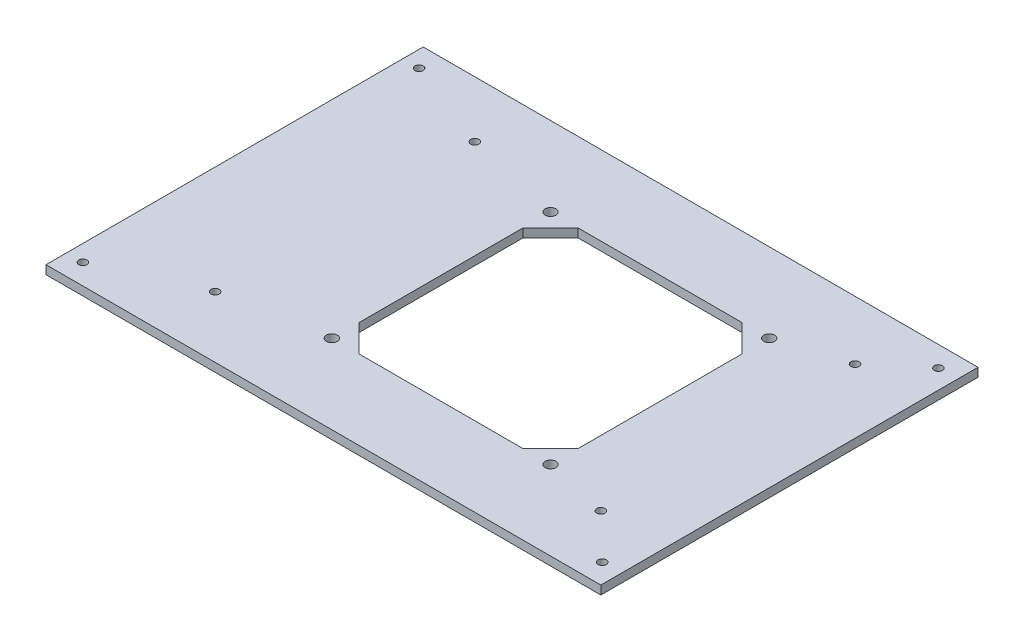
ISO-10303-21;
HEADER;
FILE_DESCRIPTION(('STEP AP214'),'2;1');
FILE_NAME('part.step','',(''),(''),'','','');
FILE_SCHEMA(('AUTOMOTIVE_DESIGN { 1 0 10303 214 1 1 1 1 }'));
ENDSEC;
DATA;
#1=APPLICATION_CONTEXT('core data for automotive mechanical design processes');
#2=APPLICATION_PROTOCOL_DEFINITION('international standard','automotive_design',2000,#1);
#3=PRODUCT_CONTEXT('',#1,'mechanical');
#4=PRODUCT('Part','Part','',(#3));
#5=PRODUCT_RELATED_PRODUCT_CATEGORY('part','',(#4));
#6=PRODUCT_DEFINITION_FORMATION('','',#4);
#7=PRODUCT_DEFINITION_CONTEXT('part definition',#1,'design');
#8=PRODUCT_DEFINITION('design','',#6,#7);
#9=PRODUCT_DEFINITION_SHAPE('','',#8);
#10=(LENGTH_UNIT() NAMED_UNIT(*) SI_UNIT(.MILLI.,.METRE.));
#11=(NAMED_UNIT(*) PLANE_ANGLE_UNIT() SI_UNIT($,.RADIAN.));
#12=(NAMED_UNIT(*) SI_UNIT($,.STERADIAN.) SOLID_ANGLE_UNIT());
#13=UNCERTAINTY_MEASURE_WITH_UNIT(LENGTH_MEASURE(1.E-05),#10,'distance_accuracy_value','');
#14=(GEOMETRIC_REPRESENTATION_CONTEXT(3) GLOBAL_UNCERTAINTY_ASSIGNED_CONTEXT((#13)) GLOBAL_UNIT_ASSIGNED_CONTEXT((#10,
#11,#12)) REPRESENTATION_CONTEXT('',''));
#15=CARTESIAN_POINT('',(0.,0.,0.));
#16=DIRECTION('',(0.,0.,1.));
#17=DIRECTION('',(1.,0.,0.));
#18=AXIS2_PLACEMENT_3D('',#15,#16,#17);
#19=CARTESIAN_POINT('',(-101.5,3.175,69.));
#20=DIRECTION('',(1.,0.,0.));
#21=DIRECTION('',(0.,0.,-1.));
#22=AXIS2_PLACEMENT_3D('',#19,#20,#21);
#23=PLANE('',#22);
#24=DIRECTION('',(0.,0.,1.));
#25=VECTOR('',#24,1.);
#26=CARTESIAN_POINT('',(-101.5,0.,69.));
#27=LINE('',#26,#25);
#28=CARTESIAN_POINT('',(-101.5,0.,-69.));
#29=VERTEX_POINT('',#28);
#30=CARTESIAN_POINT('',(-101.5,0.,69.));
#31=VERTEX_POINT('',#30);
#32=EDGE_CURVE('E313',#29,#31,#27,.T.);
#33=ORIENTED_EDGE('',*,*,#32,.T.);
#34=DIRECTION('',(0.,-1.,0.));
#35=VECTOR('',#34,1.);
#36=CARTESIAN_POINT('',(-101.5,3.175,69.));
#37=LINE('',#36,#35);
#38=CARTESIAN_POINT('',(-101.5,3.175,69.));
#39=VERTEX_POINT('',#38);
#40=EDGE_CURVE('E11',#39,#31,#37,.T.);
#41=ORIENTED_EDGE('',*,*,#40,.F.);
#42=DIRECTION('',(0.,0.,1.));
#43=VECTOR('',#42,1.);
#44=CARTESIAN_POINT('',(-101.5,3.175,69.));
#45=LINE('',#44,#43);
#46=CARTESIAN_POINT('',(-101.5,3.175,-69.));
#47=VERTEX_POINT('',#46);
#48=EDGE_CURVE('E314',#47,#39,#45,.T.);
#49=ORIENTED_EDGE('',*,*,#48,.F.);
#50=DIRECTION('',(0.,-1.,0.));
#51=VECTOR('',#50,1.);
#52=CARTESIAN_POINT('',(-101.5,3.175,-69.));
#53=LINE('',#52,#51);
#54=EDGE_CURVE('E328',#47,#29,#53,.T.);
#55=ORIENTED_EDGE('',*,*,#54,.T.);
#56=EDGE_LOOP('',(#33,#41,#49,#55));
#57=FACE_BOUND('',#56,.T.);
#58=ADVANCED_FACE('F39',(#57),#23,.F.);
#59=CARTESIAN_POINT('',(101.5,3.175,69.));
#60=DIRECTION('',(0.,0.,-1.));
#61=DIRECTION('',(-1.,0.,0.));
#62=AXIS2_PLACEMENT_3D('',#59,#60,#61);
#63=PLANE('',#62);
#64=DIRECTION('',(1.,0.,0.));
#65=VECTOR('',#64,1.);
#66=CARTESIAN_POINT('',(101.5,0.,69.));
#67=LINE('',#66,#65);
#68=CARTESIAN_POINT('',(101.5,0.,69.));
#69=VERTEX_POINT('',#68);
#70=EDGE_CURVE('E332',#31,#69,#67,.T.);
#71=ORIENTED_EDGE('',*,*,#70,.T.);
#72=DIRECTION('',(0.,-1.,0.));
#73=VECTOR('',#72,1.);
#74=CARTESIAN_POINT('',(101.5,3.175,69.));
#75=LINE('',#74,#73);
#76=CARTESIAN_POINT('',(101.5,3.175,69.));
#77=VERTEX_POINT('',#76);
#78=EDGE_CURVE('E47',#77,#69,#75,.T.);
#79=ORIENTED_EDGE('',*,*,#78,.F.);
#80=DIRECTION('',(1.,0.,0.));
#81=VECTOR('',#80,1.);
#82=CARTESIAN_POINT('',(101.5,3.175,69.));
#83=LINE('',#82,#81);
#84=EDGE_CURVE('E318',#39,#77,#83,.T.);
#85=ORIENTED_EDGE('',*,*,#84,.F.);
#86=ORIENTED_EDGE('',*,*,#40,.T.);
#87=EDGE_LOOP('',(#71,#79,#85,#86));
#88=FACE_BOUND('',#87,.T.);
#89=ADVANCED_FACE('F367',(#88),#63,.F.);
#90=CARTESIAN_POINT('',(101.5,3.175,69.));
#91=DIRECTION('',(-1.,0.,0.));
#92=DIRECTION('',(0.,0.,1.));
#93=AXIS2_PLACEMENT_3D('',#90,#91,#92);
#94=PLANE('',#93);
#95=DIRECTION('',(0.,0.,-1.));
#96=VECTOR('',#95,1.);
#97=CARTESIAN_POINT('',(101.5,0.,69.));
#98=LINE('',#97,#96);
#99=CARTESIAN_POINT('',(101.5,0.,-69.));
#100=VERTEX_POINT('',#99);
#101=EDGE_CURVE('E335',#69,#100,#98,.T.);
#102=ORIENTED_EDGE('',*,*,#101,.T.);
#103=DIRECTION('',(0.,-1.,0.));
#104=VECTOR('',#103,1.);
#105=CARTESIAN_POINT('',(101.5,3.175,-69.));
#106=LINE('',#105,#104);
#107=CARTESIAN_POINT('',(101.5,3.175,-69.));
#108=VERTEX_POINT('',#107);
#109=EDGE_CURVE('E343',#108,#100,#106,.T.);
#110=ORIENTED_EDGE('',*,*,#109,.F.);
#111=DIRECTION('',(0.,0.,-1.));
#112=VECTOR('',#111,1.);
#113=CARTESIAN_POINT('',(101.5,3.175,69.));
#114=LINE('',#113,#112);
#115=EDGE_CURVE('E322',#77,#108,#114,.T.);
#116=ORIENTED_EDGE('',*,*,#115,.F.);
#117=ORIENTED_EDGE('',*,*,#78,.T.);
#118=EDGE_LOOP('',(#102,#110,#116,#117));
#119=FACE_BOUND('',#118,.T.);
#120=ADVANCED_FACE('F352',(#119),#94,.F.);
#121=CARTESIAN_POINT('',(101.5,3.175,-69.));
#122=DIRECTION('',(0.,0.,1.));
#123=DIRECTION('',(1.,0.,0.));
#124=AXIS2_PLACEMENT_3D('',#121,#122,#123);
#125=PLANE('',#124);
#126=DIRECTION('',(-1.,0.,0.));
#127=VECTOR('',#126,1.);
#128=CARTESIAN_POINT('',(101.5,0.,-69.));
#129=LINE('',#128,#127);
#130=EDGE_CURVE('E319',#100,#29,#129,.T.);
#131=ORIENTED_EDGE('',*,*,#130,.T.);
#132=ORIENTED_EDGE('',*,*,#54,.F.);
#133=DIRECTION('',(-1.,0.,0.));
#134=VECTOR('',#133,1.);
#135=CARTESIAN_POINT('',(101.5,3.175,-69.));
#136=LINE('',#135,#134);
#137=EDGE_CURVE('E325',#108,#47,#136,.T.);
#138=ORIENTED_EDGE('',*,*,#137,.F.);
#139=ORIENTED_EDGE('',*,*,#109,.T.);
#140=EDGE_LOOP('',(#131,#132,#138,#139));
#141=FACE_BOUND('',#140,.T.);
#142=ADVANCED_FACE('F360',(#141),#125,.F.);
#143=CARTESIAN_POINT('',(0.,3.175,0.));
#144=DIRECTION('',(0.,1.,0.));
#145=DIRECTION('',(0.,0.,1.));
#146=AXIS2_PLACEMENT_3D('',#143,#144,#145);
#147=PLANE('',#146);
#148=DIRECTION('',(0.,0.,1.));
#149=VECTOR('',#148,1.);
#150=CARTESIAN_POINT('',(-25.9,3.175,-30.));
#151=LINE('',#150,#149);
#152=CARTESIAN_POINT('',(-25.9,3.175,-30.));
#153=VERTEX_POINT('',#152);
#154=CARTESIAN_POINT('',(-25.9,3.175,30.));
#155=VERTEX_POINT('',#154);
#156=EDGE_CURVE('E54',#153,#155,#151,.T.);
#157=ORIENTED_EDGE('',*,*,#156,.F.);
#158=DIRECTION('',(0.707106781186548,0.,-0.707106781186547));
#159=VECTOR('',#158,1.);
#160=CARTESIAN_POINT('',(-25.9,3.175,-30.));
#161=LINE('',#160,#159);
#162=CARTESIAN_POINT('',(-15.9,3.175,-40.));
#163=VERTEX_POINT('',#162);
#164=EDGE_CURVE('E150',#153,#163,#161,.T.);
#165=ORIENTED_EDGE('',*,*,#164,.T.);
#166=DIRECTION('',(1.,0.,0.));
#167=VECTOR('',#166,1.);
#168=CARTESIAN_POINT('',(-15.9,3.175,-40.));
#169=LINE('',#168,#167);
#170=CARTESIAN_POINT('',(44.1,3.175,-40.));
#171=VERTEX_POINT('',#170);
#172=EDGE_CURVE('E154',#163,#171,#169,.T.);
#173=ORIENTED_EDGE('',*,*,#172,.T.);
#174=DIRECTION('',(0.707106781186548,0.,0.707106781186547));
#175=VECTOR('',#174,1.);
#176=CARTESIAN_POINT('',(44.1,3.175,-40.));
#177=LINE('',#176,#175);
#178=CARTESIAN_POINT('',(54.1,3.175,-30.));
#179=VERTEX_POINT('',#178);
#180=EDGE_CURVE('E190',#171,#179,#177,.T.);
#181=ORIENTED_EDGE('',*,*,#180,.T.);
#182=DIRECTION('',(0.,0.,1.));
#183=VECTOR('',#182,1.);
#184=CARTESIAN_POINT('',(54.1,3.175,-30.));
#185=LINE('',#184,#183);
#186=CARTESIAN_POINT('',(54.1,3.175,30.));
#187=VERTEX_POINT('',#186);
#188=EDGE_CURVE('E186',#179,#187,#185,.T.);
#189=ORIENTED_EDGE('',*,*,#188,.T.);
#190=DIRECTION('',(-0.707106781186547,0.,0.707106781186548));
#191=VECTOR('',#190,1.);
#192=CARTESIAN_POINT('',(54.1,3.175,30.));
#193=LINE('',#192,#191);
#194=CARTESIAN_POINT('',(44.1,3.175,40.));
#195=VERTEX_POINT('',#194);
#196=EDGE_CURVE('E182',#187,#195,#193,.T.);
#197=ORIENTED_EDGE('',*,*,#196,.T.);
#198=DIRECTION('',(1.,0.,0.));
#199=VECTOR('',#198,1.);
#200=CARTESIAN_POINT('',(-15.9,3.175,40.));
#201=LINE('',#200,#199);
#202=CARTESIAN_POINT('',(-15.9,3.175,40.));
#203=VERTEX_POINT('',#202);
#204=EDGE_CURVE('E178',#203,#195,#201,.T.);
#205=ORIENTED_EDGE('',*,*,#204,.F.);
#206=DIRECTION('',(0.707106781186548,0.,0.707106781186548));
#207=VECTOR('',#206,1.);
#208=CARTESIAN_POINT('',(-25.9,3.175,30.));
#209=LINE('',#208,#207);
#210=EDGE_CURVE('E175',#155,#203,#209,.T.);
#211=ORIENTED_EDGE('',*,*,#210,.F.);
#212=EDGE_LOOP('',(#157,#165,#173,#181,#189,#197,#205,#211));
#213=FACE_BOUND('',#212,.T.);
#214=CARTESIAN_POINT('',(-25.9,3.175,-40.));
#215=DIRECTION('',(0.,1.,0.));
#216=DIRECTION('',(0.,0.,1.));
#217=AXIS2_PLACEMENT_3D('',#214,#215,#216);
#218=CIRCLE('',#217,2.);
#219=CARTESIAN_POINT('',(-25.9,3.175,-38.));
#220=VERTEX_POINT('',#219);
#221=EDGE_CURVE('E200',#220,#220,#218,.T.);
#222=ORIENTED_EDGE('',*,*,#221,.F.);
#223=EDGE_LOOP('',(#222));
#224=FACE_BOUND('',#223,.T.);
#225=CARTESIAN_POINT('',(54.1,3.175,-40.));
#226=DIRECTION('',(0.,1.,0.));
#227=DIRECTION('',(0.,0.,1.));
#228=AXIS2_PLACEMENT_3D('',#225,#226,#227);
#229=CIRCLE('',#228,2.);
#230=CARTESIAN_POINT('',(54.1,3.175,-38.));
#231=VERTEX_POINT('',#230);
#232=EDGE_CURVE('E225',#231,#231,#229,.T.);
#233=ORIENTED_EDGE('',*,*,#232,.F.);
#234=EDGE_LOOP('',(#233));
#235=FACE_BOUND('',#234,.T.);
#236=CARTESIAN_POINT('',(54.1,3.175,40.));
#237=DIRECTION('',(0.,1.,0.));
#238=DIRECTION('',(0.,0.,1.));
#239=AXIS2_PLACEMENT_3D('',#236,#237,#238);
#240=CIRCLE('',#239,2.);
#241=CARTESIAN_POINT('',(54.1,3.175,42.));
#242=VERTEX_POINT('',#241);
#243=EDGE_CURVE('E233',#242,#242,#240,.T.);
#244=ORIENTED_EDGE('',*,*,#243,.F.);
#245=EDGE_LOOP('',(#244));
#246=FACE_BOUND('',#245,.T.);
#247=CARTESIAN_POINT('',(-25.9,3.175,40.));
#248=DIRECTION('',(0.,1.,0.));
#249=DIRECTION('',(0.,0.,1.));
#250=AXIS2_PLACEMENT_3D('',#247,#248,#249);
#251=CIRCLE('',#250,2.);
#252=CARTESIAN_POINT('',(-25.9,3.175,42.));
#253=VERTEX_POINT('',#252);
#254=EDGE_CURVE('E241',#253,#253,#251,.T.);
#255=ORIENTED_EDGE('',*,*,#254,.F.);
#256=EDGE_LOOP('',(#255));
#257=FACE_BOUND('',#256,.T.);
#258=CARTESIAN_POINT('',(-95.5,3.175,-61.5));
#259=DIRECTION('',(0.,1.,0.));
#260=DIRECTION('',(0.,0.,1.));
#261=AXIS2_PLACEMENT_3D('',#258,#259,#260);
#262=CIRCLE('',#261,1.5);
#263=CARTESIAN_POINT('',(-95.5,3.175,-60.));
#264=VERTEX_POINT('',#263);
#265=EDGE_CURVE('E249',#264,#264,#262,.T.);
#266=ORIENTED_EDGE('',*,*,#265,.F.);
#267=EDGE_LOOP('',(#266));
#268=FACE_BOUND('',#267,.T.);
#269=CARTESIAN_POINT('',(94.5,3.175,-61.5));
#270=DIRECTION('',(0.,1.,0.));
#271=DIRECTION('',(0.,0.,1.));
#272=AXIS2_PLACEMENT_3D('',#269,#270,#271);
#273=CIRCLE('',#272,1.5);
#274=CARTESIAN_POINT('',(94.5,3.175,-60.));
#275=VERTEX_POINT('',#274);
#276=EDGE_CURVE('E257',#275,#275,#273,.T.);
#277=ORIENTED_EDGE('',*,*,#276,.F.);
#278=EDGE_LOOP('',(#277));
#279=FACE_BOUND('',#278,.T.);
#280=CARTESIAN_POINT('',(94.5,3.175,61.5));
#281=DIRECTION('',(0.,1.,0.));
#282=DIRECTION('',(0.,0.,1.));
#283=AXIS2_PLACEMENT_3D('',#280,#281,#282);
#284=CIRCLE('',#283,1.5);
#285=CARTESIAN_POINT('',(94.5,3.175,63.));
#286=VERTEX_POINT('',#285);
#287=EDGE_CURVE('E265',#286,#286,#284,.T.);
#288=ORIENTED_EDGE('',*,*,#287,.F.);
#289=EDGE_LOOP('',(#288));
#290=FACE_BOUND('',#289,.T.);
#291=CARTESIAN_POINT('',(-95.5,3.175,61.5));
#292=DIRECTION('',(0.,1.,0.));
#293=DIRECTION('',(0.,0.,1.));
#294=AXIS2_PLACEMENT_3D('',#291,#292,#293);
#295=CIRCLE('',#294,1.5);
#296=CARTESIAN_POINT('',(-95.5,3.175,63.));
#297=VERTEX_POINT('',#296);
#298=EDGE_CURVE('E273',#297,#297,#295,.T.);
#299=ORIENTED_EDGE('',*,*,#298,.F.);
#300=EDGE_LOOP('',(#299));
#301=FACE_BOUND('',#300,.T.);
#302=CARTESIAN_POINT('',(-62.,3.175,46.6));
#303=DIRECTION('',(0.,1.,0.));
#304=DIRECTION('',(0.,0.,1.));
#305=AXIS2_PLACEMENT_3D('',#302,#303,#304);
#306=CIRCLE('',#305,1.5);
#307=CARTESIAN_POINT('',(-62.,3.175,48.1));
#308=VERTEX_POINT('',#307);
#309=EDGE_CURVE('E281',#308,#308,#306,.T.);
#310=ORIENTED_EDGE('',*,*,#309,.F.);
#311=EDGE_LOOP('',(#310));
#312=FACE_BOUND('',#311,.T.);
#313=CARTESIAN_POINT('',(78.,3.175,45.5));
#314=DIRECTION('',(0.,1.,0.));
#315=DIRECTION('',(0.,0.,1.));
#316=AXIS2_PLACEMENT_3D('',#313,#314,#315);
#317=CIRCLE('',#316,1.5);
#318=CARTESIAN_POINT('',(78.,3.175,47.));
#319=VERTEX_POINT('',#318);
#320=EDGE_CURVE('E289',#319,#319,#317,.T.);
#321=ORIENTED_EDGE('',*,*,#320,.F.);
#322=EDGE_LOOP('',(#321));
#323=FACE_BOUND('',#322,.T.);
#324=CARTESIAN_POINT('',(78.,3.175,-47.5));
#325=DIRECTION('',(0.,1.,0.));
#326=DIRECTION('',(0.,0.,1.));
#327=AXIS2_PLACEMENT_3D('',#324,#325,#326);
#328=CIRCLE('',#327,1.5);
#329=CARTESIAN_POINT('',(78.,3.175,-46.));
#330=VERTEX_POINT('',#329);
#331=EDGE_CURVE('E297',#330,#330,#328,.T.);
#332=ORIENTED_EDGE('',*,*,#331,.F.);
#333=EDGE_LOOP('',(#332));
#334=FACE_BOUND('',#333,.T.);
#335=CARTESIAN_POINT('',(-62.,3.175,-48.4));
#336=DIRECTION('',(0.,1.,0.));
#337=DIRECTION('',(0.,0.,1.));
#338=AXIS2_PLACEMENT_3D('',#335,#336,#337);
#339=CIRCLE('',#338,1.5);
#340=CARTESIAN_POINT('',(-62.,3.175,-46.9));
#341=VERTEX_POINT('',#340);
#342=EDGE_CURVE('E305',#341,#341,#339,.T.);
#343=ORIENTED_EDGE('',*,*,#342,.F.);
#344=EDGE_LOOP('',(#343));
#345=FACE_BOUND('',#344,.T.);
#346=ORIENTED_EDGE('',*,*,#48,.T.);
#347=ORIENTED_EDGE('',*,*,#84,.T.);
#348=ORIENTED_EDGE('',*,*,#115,.T.);
#349=ORIENTED_EDGE('',*,*,#137,.T.);
#350=EDGE_LOOP('',(#346,#347,#348,#349));
#351=FACE_BOUND('',#350,.T.);
#352=ADVANCED_FACE('F366',(#213,#224,#235,#246,#257,#268,#279,#290,#301,#312,#323,#334,#345,
#351),#147,.T.);
#353=CARTESIAN_POINT('',(0.,0.,0.));
#354=DIRECTION('',(0.,1.,0.));
#355=DIRECTION('',(0.,0.,1.));
#356=AXIS2_PLACEMENT_3D('',#353,#354,#355);
#357=PLANE('',#356);
#358=DIRECTION('',(0.707106781186548,0.,-0.707106781186547));
#359=VECTOR('',#358,1.);
#360=CARTESIAN_POINT('',(-25.9,0.,-30.));
#361=LINE('',#360,#359);
#362=CARTESIAN_POINT('',(-25.9,0.,-30.));
#363=VERTEX_POINT('',#362);
#364=CARTESIAN_POINT('',(-15.9,0.,-40.));
#365=VERTEX_POINT('',#364);
#366=EDGE_CURVE('E138',#363,#365,#361,.T.);
#367=ORIENTED_EDGE('',*,*,#366,.F.);
#368=DIRECTION('',(0.,0.,1.));
#369=VECTOR('',#368,1.);
#370=CARTESIAN_POINT('',(-25.9,0.,-30.));
#371=LINE('',#370,#369);
#372=CARTESIAN_POINT('',(-25.9,0.,30.));
#373=VERTEX_POINT('',#372);
#374=EDGE_CURVE('E131',#363,#373,#371,.T.);
#375=ORIENTED_EDGE('',*,*,#374,.T.);
#376=DIRECTION('',(0.707106781186548,0.,0.707106781186548));
#377=VECTOR('',#376,1.);
#378=CARTESIAN_POINT('',(-25.9,0.,30.));
#379=LINE('',#378,#377);
#380=CARTESIAN_POINT('',(-15.9,0.,40.));
#381=VERTEX_POINT('',#380);
#382=EDGE_CURVE('E141',#373,#381,#379,.T.);
#383=ORIENTED_EDGE('',*,*,#382,.T.);
#384=DIRECTION('',(1.,0.,0.));
#385=VECTOR('',#384,1.);
#386=CARTESIAN_POINT('',(-15.9,0.,40.));
#387=LINE('',#386,#385);
#388=CARTESIAN_POINT('',(44.1,0.,40.));
#389=VERTEX_POINT('',#388);
#390=EDGE_CURVE('E62',#381,#389,#387,.T.);
#391=ORIENTED_EDGE('',*,*,#390,.T.);
#392=DIRECTION('',(-0.707106781186547,0.,0.707106781186548));
#393=VECTOR('',#392,1.);
#394=CARTESIAN_POINT('',(54.1,0.,30.));
#395=LINE('',#394,#393);
#396=CARTESIAN_POINT('',(54.1,0.,30.));
#397=VERTEX_POINT('',#396);
#398=EDGE_CURVE('E159',#397,#389,#395,.T.);
#399=ORIENTED_EDGE('',*,*,#398,.F.);
#400=DIRECTION('',(0.,0.,1.));
#401=VECTOR('',#400,1.);
#402=CARTESIAN_POINT('',(54.1,0.,-30.));
#403=LINE('',#402,#401);
#404=CARTESIAN_POINT('',(54.1,0.,-30.));
#405=VERTEX_POINT('',#404);
#406=EDGE_CURVE('E162',#405,#397,#403,.T.);
#407=ORIENTED_EDGE('',*,*,#406,.F.);
#408=DIRECTION('',(0.707106781186548,0.,0.707106781186547));
#409=VECTOR('',#408,1.);
#410=CARTESIAN_POINT('',(44.1,0.,-40.));
#411=LINE('',#410,#409);
#412=CARTESIAN_POINT('',(44.1,0.,-40.));
#413=VERTEX_POINT('',#412);
#414=EDGE_CURVE('E165',#413,#405,#411,.T.);
#415=ORIENTED_EDGE('',*,*,#414,.F.);
#416=DIRECTION('',(1.,0.,0.));
#417=VECTOR('',#416,1.);
#418=CARTESIAN_POINT('',(-15.9,0.,-40.));
#419=LINE('',#418,#417);
#420=EDGE_CURVE('E168',#365,#413,#419,.T.);
#421=ORIENTED_EDGE('',*,*,#420,.F.);
#422=EDGE_LOOP('',(#367,#375,#383,#391,#399,#407,#415,#421));
#423=FACE_BOUND('',#422,.T.);
#424=CARTESIAN_POINT('',(-25.9,0.,-40.));
#425=DIRECTION('',(0.,1.,0.));
#426=DIRECTION('',(0.,0.,1.));
#427=AXIS2_PLACEMENT_3D('',#424,#425,#426);
#428=CIRCLE('',#427,2.);
#429=CARTESIAN_POINT('',(-25.9,0.,-38.));
#430=VERTEX_POINT('',#429);
#431=EDGE_CURVE('E221',#430,#430,#428,.T.);
#432=ORIENTED_EDGE('',*,*,#431,.T.);
#433=EDGE_LOOP('',(#432));
#434=FACE_BOUND('',#433,.T.);
#435=CARTESIAN_POINT('',(54.1,0.,-40.));
#436=DIRECTION('',(0.,1.,0.));
#437=DIRECTION('',(0.,0.,1.));
#438=AXIS2_PLACEMENT_3D('',#435,#436,#437);
#439=CIRCLE('',#438,2.);
#440=CARTESIAN_POINT('',(54.1,0.,-38.));
#441=VERTEX_POINT('',#440);
#442=EDGE_CURVE('E229',#441,#441,#439,.T.);
#443=ORIENTED_EDGE('',*,*,#442,.T.);
#444=EDGE_LOOP('',(#443));
#445=FACE_BOUND('',#444,.T.);
#446=CARTESIAN_POINT('',(54.1,0.,40.));
#447=DIRECTION('',(0.,1.,0.));
#448=DIRECTION('',(0.,0.,1.));
#449=AXIS2_PLACEMENT_3D('',#446,#447,#448);
#450=CIRCLE('',#449,2.);
#451=CARTESIAN_POINT('',(54.1,0.,42.));
#452=VERTEX_POINT('',#451);
#453=EDGE_CURVE('E237',#452,#452,#450,.T.);
#454=ORIENTED_EDGE('',*,*,#453,.T.);
#455=EDGE_LOOP('',(#454));
#456=FACE_BOUND('',#455,.T.);
#457=CARTESIAN_POINT('',(-25.9,0.,40.));
#458=DIRECTION('',(0.,1.,0.));
#459=DIRECTION('',(0.,0.,1.));
#460=AXIS2_PLACEMENT_3D('',#457,#458,#459);
#461=CIRCLE('',#460,2.);
#462=CARTESIAN_POINT('',(-25.9,0.,42.));
#463=VERTEX_POINT('',#462);
#464=EDGE_CURVE('E245',#463,#463,#461,.T.);
#465=ORIENTED_EDGE('',*,*,#464,.T.);
#466=EDGE_LOOP('',(#465));
#467=FACE_BOUND('',#466,.T.);
#468=CARTESIAN_POINT('',(-95.5,0.,-61.5));
#469=DIRECTION('',(0.,1.,0.));
#470=DIRECTION('',(0.,0.,1.));
#471=AXIS2_PLACEMENT_3D('',#468,#469,#470);
#472=CIRCLE('',#471,1.5);
#473=CARTESIAN_POINT('',(-95.5,0.,-60.));
#474=VERTEX_POINT('',#473);
#475=EDGE_CURVE('E253',#474,#474,#472,.T.);
#476=ORIENTED_EDGE('',*,*,#475,.T.);
#477=EDGE_LOOP('',(#476));
#478=FACE_BOUND('',#477,.T.);
#479=CARTESIAN_POINT('',(94.5,0.,-61.5));
#480=DIRECTION('',(0.,1.,0.));
#481=DIRECTION('',(0.,0.,1.));
#482=AXIS2_PLACEMENT_3D('',#479,#480,#481);
#483=CIRCLE('',#482,1.5);
#484=CARTESIAN_POINT('',(94.5,0.,-60.));
#485=VERTEX_POINT('',#484);
#486=EDGE_CURVE('E261',#485,#485,#483,.T.);
#487=ORIENTED_EDGE('',*,*,#486,.T.);
#488=EDGE_LOOP('',(#487));
#489=FACE_BOUND('',#488,.T.);
#490=CARTESIAN_POINT('',(94.5,0.,61.5));
#491=DIRECTION('',(0.,1.,0.));
#492=DIRECTION('',(0.,0.,1.));
#493=AXIS2_PLACEMENT_3D('',#490,#491,#492);
#494=CIRCLE('',#493,1.5);
#495=CARTESIAN_POINT('',(94.5,0.,63.));
#496=VERTEX_POINT('',#495);
#497=EDGE_CURVE('E269',#496,#496,#494,.T.);
#498=ORIENTED_EDGE('',*,*,#497,.T.);
#499=EDGE_LOOP('',(#498));
#500=FACE_BOUND('',#499,.T.);
#501=CARTESIAN_POINT('',(-95.5,0.,61.5));
#502=DIRECTION('',(0.,1.,0.));
#503=DIRECTION('',(0.,0.,1.));
#504=AXIS2_PLACEMENT_3D('',#501,#502,#503);
#505=CIRCLE('',#504,1.5);
#506=CARTESIAN_POINT('',(-95.5,0.,63.));
#507=VERTEX_POINT('',#506);
#508=EDGE_CURVE('E277',#507,#507,#505,.T.);
#509=ORIENTED_EDGE('',*,*,#508,.T.);
#510=EDGE_LOOP('',(#509));
#511=FACE_BOUND('',#510,.T.);
#512=CARTESIAN_POINT('',(-62.,0.,46.6));
#513=DIRECTION('',(0.,1.,0.));
#514=DIRECTION('',(0.,0.,1.));
#515=AXIS2_PLACEMENT_3D('',#512,#513,#514);
#516=CIRCLE('',#515,1.5);
#517=CARTESIAN_POINT('',(-62.,0.,48.1));
#518=VERTEX_POINT('',#517);
#519=EDGE_CURVE('E285',#518,#518,#516,.T.);
#520=ORIENTED_EDGE('',*,*,#519,.T.);
#521=EDGE_LOOP('',(#520));
#522=FACE_BOUND('',#521,.T.);
#523=CARTESIAN_POINT('',(78.,0.,45.5));
#524=DIRECTION('',(0.,1.,0.));
#525=DIRECTION('',(0.,0.,1.));
#526=AXIS2_PLACEMENT_3D('',#523,#524,#525);
#527=CIRCLE('',#526,1.5);
#528=CARTESIAN_POINT('',(78.,0.,47.));
#529=VERTEX_POINT('',#528);
#530=EDGE_CURVE('E293',#529,#529,#527,.T.);
#531=ORIENTED_EDGE('',*,*,#530,.T.);
#532=EDGE_LOOP('',(#531));
#533=FACE_BOUND('',#532,.T.);
#534=CARTESIAN_POINT('',(78.,0.,-47.5));
#535=DIRECTION('',(0.,1.,0.));
#536=DIRECTION('',(0.,0.,1.));
#537=AXIS2_PLACEMENT_3D('',#534,#535,#536);
#538=CIRCLE('',#537,1.5);
#539=CARTESIAN_POINT('',(78.,0.,-46.));
#540=VERTEX_POINT('',#539);
#541=EDGE_CURVE('E301',#540,#540,#538,.T.);
#542=ORIENTED_EDGE('',*,*,#541,.T.);
#543=EDGE_LOOP('',(#542));
#544=FACE_BOUND('',#543,.T.);
#545=CARTESIAN_POINT('',(-62.,0.,-48.4));
#546=DIRECTION('',(0.,1.,0.));
#547=DIRECTION('',(0.,0.,1.));
#548=AXIS2_PLACEMENT_3D('',#545,#546,#547);
#549=CIRCLE('',#548,1.5);
#550=CARTESIAN_POINT('',(-62.,0.,-46.9));
#551=VERTEX_POINT('',#550);
#552=EDGE_CURVE('E309',#551,#551,#549,.T.);
#553=ORIENTED_EDGE('',*,*,#552,.T.);
#554=EDGE_LOOP('',(#553));
#555=FACE_BOUND('',#554,.T.);
#556=ORIENTED_EDGE('',*,*,#32,.F.);
#557=ORIENTED_EDGE('',*,*,#130,.F.);
#558=ORIENTED_EDGE('',*,*,#101,.F.);
#559=ORIENTED_EDGE('',*,*,#70,.F.);
#560=EDGE_LOOP('',(#556,#557,#558,#559));
#561=FACE_BOUND('',#560,.T.);
#562=ADVANCED_FACE('F146',(#423,#434,#445,#456,#467,#478,#489,#500,#511,#522,#533,#544,#555,
#561),#357,.F.);
#563=CARTESIAN_POINT('',(-62.,3.175,-48.4));
#564=DIRECTION('',(0.,1.,0.));
#565=DIRECTION('',(0.,0.,1.));
#566=AXIS2_PLACEMENT_3D('',#563,#564,#565);
#567=CYLINDRICAL_SURFACE('',#566,1.5);
#568=ORIENTED_EDGE('',*,*,#552,.F.);
#569=EDGE_LOOP('',(#568));
#570=FACE_BOUND('',#569,.T.);
#571=ORIENTED_EDGE('',*,*,#342,.T.);
#572=EDGE_LOOP('',(#571));
#573=FACE_BOUND('',#572,.T.);
#574=ADVANCED_FACE('F379',(#570,#573),#567,.F.);
#575=CARTESIAN_POINT('',(78.,3.175,-47.5));
#576=DIRECTION('',(0.,1.,0.));
#577=DIRECTION('',(0.,0.,1.));
#578=AXIS2_PLACEMENT_3D('',#575,#576,#577);
#579=CYLINDRICAL_SURFACE('',#578,1.5);
#580=ORIENTED_EDGE('',*,*,#541,.F.);
#581=EDGE_LOOP('',(#580));
#582=FACE_BOUND('',#581,.T.);
#583=ORIENTED_EDGE('',*,*,#331,.T.);
#584=EDGE_LOOP('',(#583));
#585=FACE_BOUND('',#584,.T.);
#586=ADVANCED_FACE('F385',(#582,#585),#579,.F.);
#587=CARTESIAN_POINT('',(78.,3.175,45.5));
#588=DIRECTION('',(0.,1.,0.));
#589=DIRECTION('',(0.,0.,1.));
#590=AXIS2_PLACEMENT_3D('',#587,#588,#589);
#591=CYLINDRICAL_SURFACE('',#590,1.5);
#592=ORIENTED_EDGE('',*,*,#530,.F.);
#593=EDGE_LOOP('',(#592));
#594=FACE_BOUND('',#593,.T.);
#595=ORIENTED_EDGE('',*,*,#320,.T.);
#596=EDGE_LOOP('',(#595));
#597=FACE_BOUND('',#596,.T.);
#598=ADVANCED_FACE('F389',(#594,#597),#591,.F.);
#599=CARTESIAN_POINT('',(-62.,3.175,46.6));
#600=DIRECTION('',(0.,1.,0.));
#601=DIRECTION('',(0.,0.,1.));
#602=AXIS2_PLACEMENT_3D('',#599,#600,#601);
#603=CYLINDRICAL_SURFACE('',#602,1.5);
#604=ORIENTED_EDGE('',*,*,#519,.F.);
#605=EDGE_LOOP('',(#604));
#606=FACE_BOUND('',#605,.T.);
#607=ORIENTED_EDGE('',*,*,#309,.T.);
#608=EDGE_LOOP('',(#607));
#609=FACE_BOUND('',#608,.T.);
#610=ADVANCED_FACE('F393',(#606,#609),#603,.F.);
#611=CARTESIAN_POINT('',(-95.5,3.175,61.5));
#612=DIRECTION('',(0.,1.,0.));
#613=DIRECTION('',(0.,0.,1.));
#614=AXIS2_PLACEMENT_3D('',#611,#612,#613);
#615=CYLINDRICAL_SURFACE('',#614,1.5);
#616=ORIENTED_EDGE('',*,*,#508,.F.);
#617=EDGE_LOOP('',(#616));
#618=FACE_BOUND('',#617,.T.);
#619=ORIENTED_EDGE('',*,*,#298,.T.);
#620=EDGE_LOOP('',(#619));
#621=FACE_BOUND('',#620,.T.);
#622=ADVANCED_FACE('F397',(#618,#621),#615,.F.);
#623=CARTESIAN_POINT('',(94.5,3.175,61.5));
#624=DIRECTION('',(0.,1.,0.));
#625=DIRECTION('',(0.,0.,1.));
#626=AXIS2_PLACEMENT_3D('',#623,#624,#625);
#627=CYLINDRICAL_SURFACE('',#626,1.5);
#628=ORIENTED_EDGE('',*,*,#497,.F.);
#629=EDGE_LOOP('',(#628));
#630=FACE_BOUND('',#629,.T.);
#631=ORIENTED_EDGE('',*,*,#287,.T.);
#632=EDGE_LOOP('',(#631));
#633=FACE_BOUND('',#632,.T.);
#634=ADVANCED_FACE('F401',(#630,#633),#627,.F.);
#635=CARTESIAN_POINT('',(94.5,3.175,-61.5));
#636=DIRECTION('',(0.,1.,0.));
#637=DIRECTION('',(0.,0.,1.));
#638=AXIS2_PLACEMENT_3D('',#635,#636,#637);
#639=CYLINDRICAL_SURFACE('',#638,1.5);
#640=ORIENTED_EDGE('',*,*,#486,.F.);
#641=EDGE_LOOP('',(#640));
#642=FACE_BOUND('',#641,.T.);
#643=ORIENTED_EDGE('',*,*,#276,.T.);
#644=EDGE_LOOP('',(#643));
#645=FACE_BOUND('',#644,.T.);
#646=ADVANCED_FACE('F405',(#642,#645),#639,.F.);
#647=CARTESIAN_POINT('',(-95.5,3.175,-61.5));
#648=DIRECTION('',(0.,1.,0.));
#649=DIRECTION('',(0.,0.,1.));
#650=AXIS2_PLACEMENT_3D('',#647,#648,#649);
#651=CYLINDRICAL_SURFACE('',#650,1.5);
#652=ORIENTED_EDGE('',*,*,#475,.F.);
#653=EDGE_LOOP('',(#652));
#654=FACE_BOUND('',#653,.T.);
#655=ORIENTED_EDGE('',*,*,#265,.T.);
#656=EDGE_LOOP('',(#655));
#657=FACE_BOUND('',#656,.T.);
#658=ADVANCED_FACE('F409',(#654,#657),#651,.F.);
#659=CARTESIAN_POINT('',(-25.9,3.175,40.));
#660=DIRECTION('',(0.,1.,0.));
#661=DIRECTION('',(0.,0.,1.));
#662=AXIS2_PLACEMENT_3D('',#659,#660,#661);
#663=CYLINDRICAL_SURFACE('',#662,2.);
#664=ORIENTED_EDGE('',*,*,#464,.F.);
#665=EDGE_LOOP('',(#664));
#666=FACE_BOUND('',#665,.T.);
#667=ORIENTED_EDGE('',*,*,#254,.T.);
#668=EDGE_LOOP('',(#667));
#669=FACE_BOUND('',#668,.T.);
#670=ADVANCED_FACE('F413',(#666,#669),#663,.F.);
#671=CARTESIAN_POINT('',(54.1,3.175,40.));
#672=DIRECTION('',(0.,1.,0.));
#673=DIRECTION('',(0.,0.,1.));
#674=AXIS2_PLACEMENT_3D('',#671,#672,#673);
#675=CYLINDRICAL_SURFACE('',#674,2.);
#676=ORIENTED_EDGE('',*,*,#453,.F.);
#677=EDGE_LOOP('',(#676));
#678=FACE_BOUND('',#677,.T.);
#679=ORIENTED_EDGE('',*,*,#243,.T.);
#680=EDGE_LOOP('',(#679));
#681=FACE_BOUND('',#680,.T.);
#682=ADVANCED_FACE('F417',(#678,#681),#675,.F.);
#683=CARTESIAN_POINT('',(54.1,3.175,-40.));
#684=DIRECTION('',(0.,1.,0.));
#685=DIRECTION('',(0.,0.,1.));
#686=AXIS2_PLACEMENT_3D('',#683,#684,#685);
#687=CYLINDRICAL_SURFACE('',#686,2.);
#688=ORIENTED_EDGE('',*,*,#442,.F.);
#689=EDGE_LOOP('',(#688));
#690=FACE_BOUND('',#689,.T.);
#691=ORIENTED_EDGE('',*,*,#232,.T.);
#692=EDGE_LOOP('',(#691));
#693=FACE_BOUND('',#692,.T.);
#694=ADVANCED_FACE('F421',(#690,#693),#687,.F.);
#695=CARTESIAN_POINT('',(-25.9,3.175,-40.));
#696=DIRECTION('',(0.,1.,0.));
#697=DIRECTION('',(0.,0.,1.));
#698=AXIS2_PLACEMENT_3D('',#695,#696,#697);
#699=CYLINDRICAL_SURFACE('',#698,2.);
#700=ORIENTED_EDGE('',*,*,#431,.F.);
#701=EDGE_LOOP('',(#700));
#702=FACE_BOUND('',#701,.T.);
#703=ORIENTED_EDGE('',*,*,#221,.T.);
#704=EDGE_LOOP('',(#703));
#705=FACE_BOUND('',#704,.T.);
#706=ADVANCED_FACE('F425',(#702,#705),#699,.F.);
#707=CARTESIAN_POINT('',(-25.9,0.,-30.));
#708=DIRECTION('',(-1.,0.,0.));
#709=DIRECTION('',(0.,0.,1.));
#710=AXIS2_PLACEMENT_3D('',#707,#708,#709);
#711=PLANE('',#710);
#712=ORIENTED_EDGE('',*,*,#156,.T.);
#713=DIRECTION('',(0.,1.,0.));
#714=VECTOR('',#713,1.);
#715=CARTESIAN_POINT('',(-25.9,0.,30.));
#716=LINE('',#715,#714);
#717=EDGE_CURVE('E127',#373,#155,#716,.T.);
#718=ORIENTED_EDGE('',*,*,#717,.F.);
#719=ORIENTED_EDGE('',*,*,#374,.F.);
#720=DIRECTION('',(0.,1.,0.));
#721=VECTOR('',#720,1.);
#722=CARTESIAN_POINT('',(-25.9,0.,-30.));
#723=LINE('',#722,#721);
#724=EDGE_CURVE('E197',#363,#153,#723,.T.);
#725=ORIENTED_EDGE('',*,*,#724,.T.);
#726=EDGE_LOOP('',(#712,#718,#719,#725));
#727=FACE_BOUND('',#726,.T.);
#728=ADVANCED_FACE('F129',(#727),#711,.F.);
#729=CARTESIAN_POINT('',(-25.9,0.,-30.));
#730=DIRECTION('',(0.707106781186547,0.,0.707106781186548));
#731=DIRECTION('',(0.707106781186548,0.,-0.707106781186547));
#732=AXIS2_PLACEMENT_3D('',#729,#730,#731);
#733=PLANE('',#732);
#734=ORIENTED_EDGE('',*,*,#164,.F.);
#735=ORIENTED_EDGE('',*,*,#724,.F.);
#736=ORIENTED_EDGE('',*,*,#366,.T.);
#737=DIRECTION('',(0.,1.,0.));
#738=VECTOR('',#737,1.);
#739=CARTESIAN_POINT('',(-15.9,0.,-40.));
#740=LINE('',#739,#738);
#741=EDGE_CURVE('E201',#365,#163,#740,.T.);
#742=ORIENTED_EDGE('',*,*,#741,.T.);
#743=EDGE_LOOP('',(#734,#735,#736,#742));
#744=FACE_BOUND('',#743,.T.);
#745=ADVANCED_FACE('F432',(#744),#733,.T.);
#746=CARTESIAN_POINT('',(-15.9,0.,-40.));
#747=DIRECTION('',(0.,0.,1.));
#748=DIRECTION('',(1.,0.,0.));
#749=AXIS2_PLACEMENT_3D('',#746,#747,#748);
#750=PLANE('',#749);
#751=ORIENTED_EDGE('',*,*,#172,.F.);
#752=ORIENTED_EDGE('',*,*,#741,.F.);
#753=ORIENTED_EDGE('',*,*,#420,.T.);
#754=DIRECTION('',(0.,1.,0.));
#755=VECTOR('',#754,1.);
#756=CARTESIAN_POINT('',(44.1,0.,-40.));
#757=LINE('',#756,#755);
#758=EDGE_CURVE('E204',#413,#171,#757,.T.);
#759=ORIENTED_EDGE('',*,*,#758,.T.);
#760=EDGE_LOOP('',(#751,#752,#753,#759));
#761=FACE_BOUND('',#760,.T.);
#762=ADVANCED_FACE('F449',(#761),#750,.T.);
#763=CARTESIAN_POINT('',(44.1,0.,-40.));
#764=DIRECTION('',(-0.707106781186547,0.,0.707106781186548));
#765=DIRECTION('',(0.707106781186548,0.,0.707106781186547));
#766=AXIS2_PLACEMENT_3D('',#763,#764,#765);
#767=PLANE('',#766);
#768=ORIENTED_EDGE('',*,*,#180,.F.);
#769=ORIENTED_EDGE('',*,*,#758,.F.);
#770=ORIENTED_EDGE('',*,*,#414,.T.);
#771=DIRECTION('',(0.,1.,0.));
#772=VECTOR('',#771,1.);
#773=CARTESIAN_POINT('',(54.1,0.,-30.));
#774=LINE('',#773,#772);
#775=EDGE_CURVE('E207',#405,#179,#774,.T.);
#776=ORIENTED_EDGE('',*,*,#775,.T.);
#777=EDGE_LOOP('',(#768,#769,#770,#776));
#778=FACE_BOUND('',#777,.T.);
#779=ADVANCED_FACE('F445',(#778),#767,.T.);
#780=CARTESIAN_POINT('',(54.1,0.,-30.));
#781=DIRECTION('',(-1.,0.,0.));
#782=DIRECTION('',(0.,0.,1.));
#783=AXIS2_PLACEMENT_3D('',#780,#781,#782);
#784=PLANE('',#783);
#785=ORIENTED_EDGE('',*,*,#188,.F.);
#786=ORIENTED_EDGE('',*,*,#775,.F.);
#787=ORIENTED_EDGE('',*,*,#406,.T.);
#788=DIRECTION('',(0.,1.,0.));
#789=VECTOR('',#788,1.);
#790=CARTESIAN_POINT('',(54.1,0.,30.));
#791=LINE('',#790,#789);
#792=EDGE_CURVE('E210',#397,#187,#791,.T.);
#793=ORIENTED_EDGE('',*,*,#792,.T.);
#794=EDGE_LOOP('',(#785,#786,#787,#793));
#795=FACE_BOUND('',#794,.T.);
#796=ADVANCED_FACE('F441',(#795),#784,.T.);
#797=CARTESIAN_POINT('',(54.1,0.,30.));
#798=DIRECTION('',(-0.707106781186548,0.,-0.707106781186547));
#799=DIRECTION('',(-0.707106781186547,0.,0.707106781186548));
#800=AXIS2_PLACEMENT_3D('',#797,#798,#799);
#801=PLANE('',#800);
#802=ORIENTED_EDGE('',*,*,#196,.F.);
#803=ORIENTED_EDGE('',*,*,#792,.F.);
#804=ORIENTED_EDGE('',*,*,#398,.T.);
#805=DIRECTION('',(0.,1.,0.));
#806=VECTOR('',#805,1.);
#807=CARTESIAN_POINT('',(44.1,0.,40.));
#808=LINE('',#807,#806);
#809=EDGE_CURVE('E213',#389,#195,#808,.T.);
#810=ORIENTED_EDGE('',*,*,#809,.T.);
#811=EDGE_LOOP('',(#802,#803,#804,#810));
#812=FACE_BOUND('',#811,.T.);
#813=ADVANCED_FACE('F438',(#812),#801,.T.);
#814=CARTESIAN_POINT('',(-15.9,0.,40.));
#815=DIRECTION('',(0.,0.,1.));
#816=DIRECTION('',(1.,0.,0.));
#817=AXIS2_PLACEMENT_3D('',#814,#815,#816);
#818=PLANE('',#817);
#819=ORIENTED_EDGE('',*,*,#204,.T.);
#820=ORIENTED_EDGE('',*,*,#809,.F.);
#821=ORIENTED_EDGE('',*,*,#390,.F.);
#822=DIRECTION('',(0.,1.,0.));
#823=VECTOR('',#822,1.);
#824=CARTESIAN_POINT('',(-15.9,0.,40.));
#825=LINE('',#824,#823);
#826=EDGE_CURVE('E137',#381,#203,#825,.T.);
#827=ORIENTED_EDGE('',*,*,#826,.T.);
#828=EDGE_LOOP('',(#819,#820,#821,#827));
#829=FACE_BOUND('',#828,.T.);
#830=ADVANCED_FACE('F435',(#829),#818,.F.);
#831=CARTESIAN_POINT('',(-25.9,0.,30.));
#832=DIRECTION('',(-0.707106781186548,0.,0.707106781186548));
#833=DIRECTION('',(0.707106781186548,0.,0.707106781186548));
#834=AXIS2_PLACEMENT_3D('',#831,#832,#833);
#835=PLANE('',#834);
#836=ORIENTED_EDGE('',*,*,#210,.T.);
#837=ORIENTED_EDGE('',*,*,#826,.F.);
#838=ORIENTED_EDGE('',*,*,#382,.F.);
#839=ORIENTED_EDGE('',*,*,#717,.T.);
#840=EDGE_LOOP('',(#836,#837,#838,#839));
#841=FACE_BOUND('',#840,.T.);
#842=ADVANCED_FACE('F142',(#841),#835,.F.);
#843=CLOSED_SHELL('',(#58,#89,#120,#142,#352,#562,#574,#586,#598,#610,#622,#634,#646,#658,#670,
#682,#694,#706,#728,#745,#762,#779,#796,#813,#830,#842));
#844=MANIFOLD_SOLID_BREP('B2',#843);
#845=ADVANCED_BREP_SHAPE_REPRESENTATION('',(#18,#844),#14);
#846=SHAPE_DEFINITION_REPRESENTATION(#9,#845);
ENDSEC;
END-ISO-10303-21;
